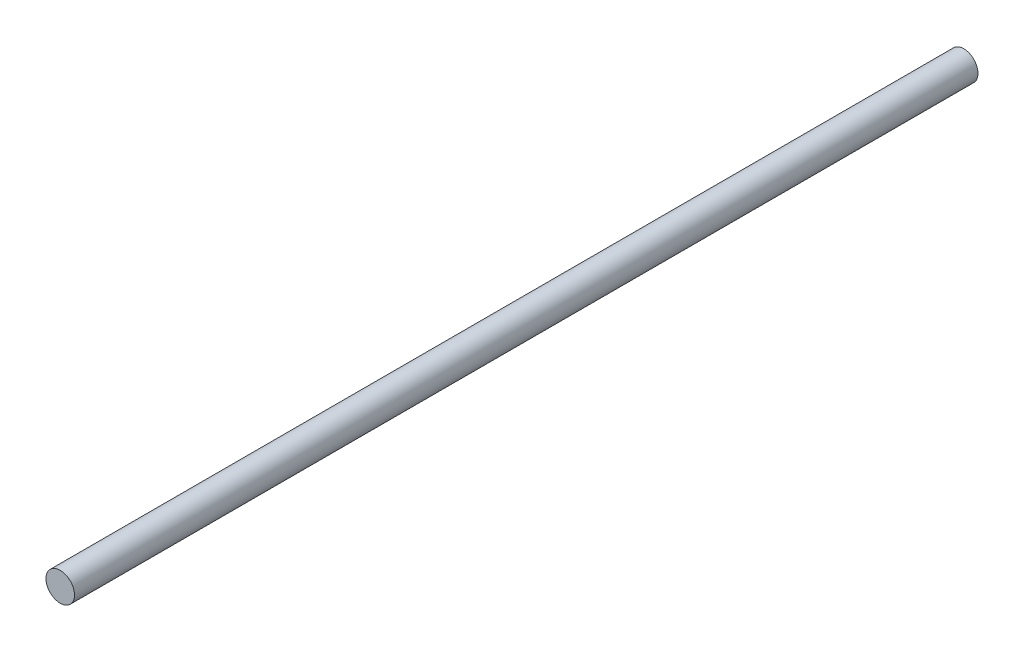
ISO-10303-21;
HEADER;
FILE_DESCRIPTION(('STEP AP214'),'2;1');
FILE_NAME('part.step','',(''),(''),'','','');
FILE_SCHEMA(('AUTOMOTIVE_DESIGN { 1 0 10303 214 1 1 1 1 }'));
ENDSEC;
DATA;
#1=APPLICATION_CONTEXT('core data for automotive mechanical design processes');
#2=APPLICATION_PROTOCOL_DEFINITION('international standard','automotive_design',2000,#1);
#3=PRODUCT_CONTEXT('',#1,'mechanical');
#4=PRODUCT('Part','Part','',(#3));
#5=PRODUCT_RELATED_PRODUCT_CATEGORY('part','',(#4));
#6=PRODUCT_DEFINITION_FORMATION('','',#4);
#7=PRODUCT_DEFINITION_CONTEXT('part definition',#1,'design');
#8=PRODUCT_DEFINITION('design','',#6,#7);
#9=PRODUCT_DEFINITION_SHAPE('','',#8);
#10=(LENGTH_UNIT() NAMED_UNIT(*) SI_UNIT(.MILLI.,.METRE.));
#11=(NAMED_UNIT(*) PLANE_ANGLE_UNIT() SI_UNIT($,.RADIAN.));
#12=(NAMED_UNIT(*) SI_UNIT($,.STERADIAN.) SOLID_ANGLE_UNIT());
#13=UNCERTAINTY_MEASURE_WITH_UNIT(LENGTH_MEASURE(1.E-05),#10,'distance_accuracy_value','');
#14=(GEOMETRIC_REPRESENTATION_CONTEXT(3) GLOBAL_UNCERTAINTY_ASSIGNED_CONTEXT((#13)) GLOBAL_UNIT_ASSIGNED_CONTEXT((#10,
#11,#12)) REPRESENTATION_CONTEXT('',''));
#15=CARTESIAN_POINT('',(0.,0.,0.));
#16=DIRECTION('',(0.,0.,1.));
#17=DIRECTION('',(1.,0.,0.));
#18=AXIS2_PLACEMENT_3D('',#15,#16,#17);
#19=CARTESIAN_POINT('',(0.,0.,190.));
#20=DIRECTION('',(0.,0.,-1.));
#21=DIRECTION('',(-1.,0.,0.));
#22=AXIS2_PLACEMENT_3D('',#19,#20,#21);
#23=CYLINDRICAL_SURFACE('',#22,3.);
#24=CARTESIAN_POINT('',(0.,0.,190.));
#25=DIRECTION('',(0.,0.,1.));
#26=DIRECTION('',(1.,0.,0.));
#27=AXIS2_PLACEMENT_3D('',#24,#25,#26);
#28=CIRCLE('',#27,3.);
#29=CARTESIAN_POINT('',(3.,0.,190.));
#30=VERTEX_POINT('',#29);
#31=EDGE_CURVE('E10',#30,#30,#28,.T.);
#32=ORIENTED_EDGE('',*,*,#31,.F.);
#33=EDGE_LOOP('',(#32));
#34=FACE_BOUND('',#33,.T.);
#35=CARTESIAN_POINT('',(0.,0.,0.));
#36=DIRECTION('',(0.,0.,1.));
#37=DIRECTION('',(1.,0.,0.));
#38=AXIS2_PLACEMENT_3D('',#35,#36,#37);
#39=CIRCLE('',#38,3.);
#40=CARTESIAN_POINT('',(3.,0.,0.));
#41=VERTEX_POINT('',#40);
#42=EDGE_CURVE('E35',#41,#41,#39,.T.);
#43=ORIENTED_EDGE('',*,*,#42,.T.);
#44=EDGE_LOOP('',(#43));
#45=FACE_BOUND('',#44,.T.);
#46=ADVANCED_FACE('F32',(#34,#45),#23,.T.);
#47=CARTESIAN_POINT('',(0.,0.,190.));
#48=DIRECTION('',(0.,0.,1.));
#49=DIRECTION('',(1.,0.,0.));
#50=AXIS2_PLACEMENT_3D('',#47,#48,#49);
#51=PLANE('',#50);
#52=ORIENTED_EDGE('',*,*,#31,.T.);
#53=EDGE_LOOP('',(#52));
#54=FACE_BOUND('',#53,.T.);
#55=ADVANCED_FACE('F47',(#54),#51,.T.);
#56=CARTESIAN_POINT('',(0.,0.,0.));
#57=DIRECTION('',(0.,0.,1.));
#58=DIRECTION('',(1.,0.,0.));
#59=AXIS2_PLACEMENT_3D('',#56,#57,#58);
#60=PLANE('',#59);
#61=ORIENTED_EDGE('',*,*,#42,.F.);
#62=EDGE_LOOP('',(#61));
#63=FACE_BOUND('',#62,.T.);
#64=ADVANCED_FACE('F45',(#63),#60,.F.);
#65=CLOSED_SHELL('',(#46,#55,#64));
#66=MANIFOLD_SOLID_BREP('B2',#65);
#67=ADVANCED_BREP_SHAPE_REPRESENTATION('',(#18,#66),#14);
#68=SHAPE_DEFINITION_REPRESENTATION(#9,#67);
ENDSEC;
END-ISO-10303-21;
